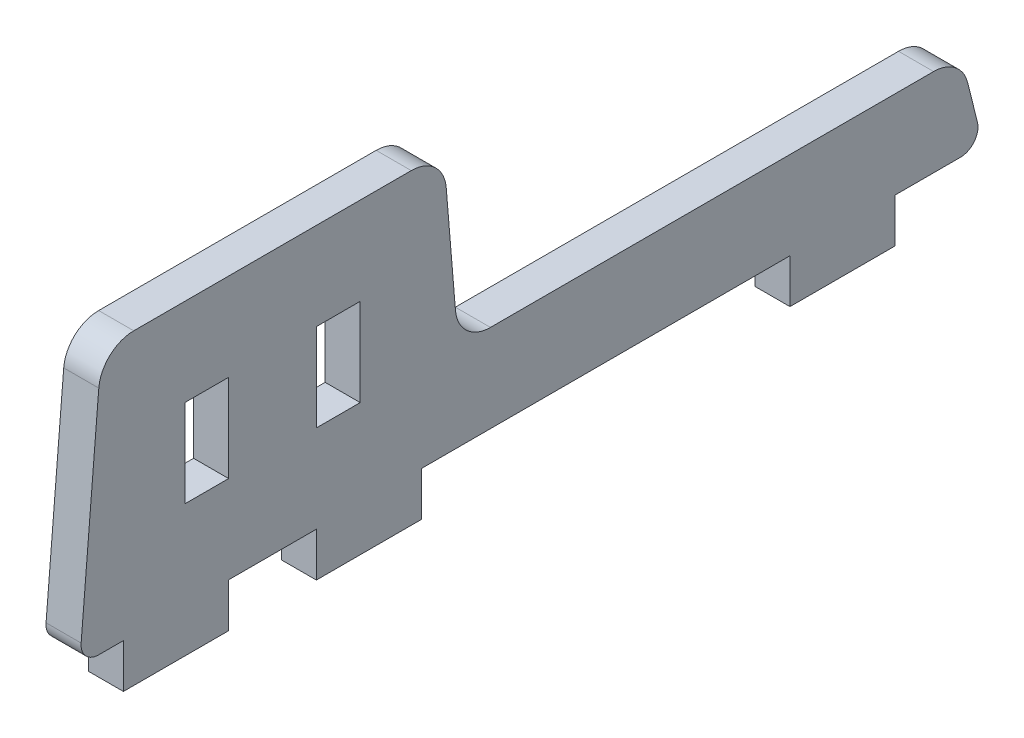
ISO-10303-21;
HEADER;
FILE_DESCRIPTION(('STEP AP214'),'2;1');
FILE_NAME('part.step','',(''),(''),'','','');
FILE_SCHEMA(('AUTOMOTIVE_DESIGN { 1 0 10303 214 1 1 1 1 }'));
ENDSEC;
DATA;
#1=APPLICATION_CONTEXT('core data for automotive mechanical design processes');
#2=APPLICATION_PROTOCOL_DEFINITION('international standard','automotive_design',2000,#1);
#3=PRODUCT_CONTEXT('',#1,'mechanical');
#4=PRODUCT('Part','Part','',(#3));
#5=PRODUCT_RELATED_PRODUCT_CATEGORY('part','',(#4));
#6=PRODUCT_DEFINITION_FORMATION('','',#4);
#7=PRODUCT_DEFINITION_CONTEXT('part definition',#1,'design');
#8=PRODUCT_DEFINITION('design','',#6,#7);
#9=PRODUCT_DEFINITION_SHAPE('','',#8);
#10=(LENGTH_UNIT() NAMED_UNIT(*) SI_UNIT(.MILLI.,.METRE.));
#11=(NAMED_UNIT(*) PLANE_ANGLE_UNIT() SI_UNIT($,.RADIAN.));
#12=(NAMED_UNIT(*) SI_UNIT($,.STERADIAN.) SOLID_ANGLE_UNIT());
#13=UNCERTAINTY_MEASURE_WITH_UNIT(LENGTH_MEASURE(1.E-05),#10,'distance_accuracy_value','');
#14=(GEOMETRIC_REPRESENTATION_CONTEXT(3) GLOBAL_UNCERTAINTY_ASSIGNED_CONTEXT((#13)) GLOBAL_UNIT_ASSIGNED_CONTEXT((#10,
#11,#12)) REPRESENTATION_CONTEXT('',''));
#15=CARTESIAN_POINT('',(0.,0.,0.));
#16=DIRECTION('',(0.,0.,1.));
#17=DIRECTION('',(1.,0.,0.));
#18=AXIS2_PLACEMENT_3D('',#15,#16,#17);
#19=CARTESIAN_POINT('',(4.,0.,0.));
#20=DIRECTION('',(-1.,0.,0.));
#21=DIRECTION('',(0.,0.,1.));
#22=AXIS2_PLACEMENT_3D('',#19,#20,#21);
#23=PLANE('',#22);
#24=DIRECTION('',(0.,1.,0.));
#25=VECTOR('',#24,1.);
#26=CARTESIAN_POINT('',(4.,5.,34.5));
#27=LINE('',#26,#25);
#28=CARTESIAN_POINT('',(4.,-5.,34.5));
#29=VERTEX_POINT('',#28);
#30=CARTESIAN_POINT('',(4.,5.,34.5));
#31=VERTEX_POINT('',#30);
#32=EDGE_CURVE('E293',#29,#31,#27,.T.);
#33=ORIENTED_EDGE('',*,*,#32,.F.);
#34=DIRECTION('',(0.,0.,-1.));
#35=VECTOR('',#34,1.);
#36=CARTESIAN_POINT('',(4.,-5.,39.5));
#37=LINE('',#36,#35);
#38=CARTESIAN_POINT('',(4.,-5.,39.5));
#39=VERTEX_POINT('',#38);
#40=EDGE_CURVE('E301',#39,#29,#37,.T.);
#41=ORIENTED_EDGE('',*,*,#40,.F.);
#42=DIRECTION('',(0.,-1.,0.));
#43=VECTOR('',#42,1.);
#44=CARTESIAN_POINT('',(4.,5.,39.5));
#45=LINE('',#44,#43);
#46=CARTESIAN_POINT('',(4.,5.,39.5));
#47=VERTEX_POINT('',#46);
#48=EDGE_CURVE('E298',#47,#39,#45,.T.);
#49=ORIENTED_EDGE('',*,*,#48,.F.);
#50=DIRECTION('',(0.,0.,1.));
#51=VECTOR('',#50,1.);
#52=CARTESIAN_POINT('',(4.,5.,39.5));
#53=LINE('',#52,#51);
#54=EDGE_CURVE('E295',#31,#47,#53,.T.);
#55=ORIENTED_EDGE('',*,*,#54,.F.);
#56=EDGE_LOOP('',(#33,#41,#49,#55));
#57=FACE_BOUND('',#56,.T.);
#58=DIRECTION('',(0.,0.,-1.));
#59=VECTOR('',#58,1.);
#60=CARTESIAN_POINT('',(4.,-15.,-41.5));
#61=LINE('',#60,#59);
#62=CARTESIAN_POINT('',(4.,-15.,-41.5));
#63=VERTEX_POINT('',#62);
#64=CARTESIAN_POINT('',(4.,-15.,-48.9384471871912));
#65=VERTEX_POINT('',#64);
#66=EDGE_CURVE('E324',#63,#65,#61,.T.);
#67=ORIENTED_EDGE('',*,*,#66,.T.);
#68=CARTESIAN_POINT('',(4.,-13.,-48.9384471871912));
#69=DIRECTION('',(-1.,0.,0.));
#70=DIRECTION('',(0.,0.,1.));
#71=AXIS2_PLACEMENT_3D('',#68,#69,#70);
#72=CIRCLE('',#71,2.);
#73=CARTESIAN_POINT('',(4.,-12.5149287499273,-50.8787321874818));
#74=VERTEX_POINT('',#73);
#75=EDGE_CURVE('E487',#65,#74,#72,.F.);
#76=ORIENTED_EDGE('',*,*,#75,.T.);
#77=DIRECTION('',(0.,0.970142500145332,0.242535625036334));
#78=VECTOR('',#77,1.);
#79=CARTESIAN_POINT('',(4.,-15.,-51.5));
#80=LINE('',#79,#78);
#81=CARTESIAN_POINT('',(4.,-8.02985749985466,-49.7574643749637));
#82=VERTEX_POINT('',#81);
#83=EDGE_CURVE('E327',#74,#82,#80,.T.);
#84=ORIENTED_EDGE('',*,*,#83,.T.);
#85=CARTESIAN_POINT('',(4.,-9.,-45.8768943743824));
#86=DIRECTION('',(-1.,0.,0.));
#87=DIRECTION('',(0.,0.,1.));
#88=AXIS2_PLACEMENT_3D('',#85,#86,#87);
#89=CIRCLE('',#88,4.);
#90=CARTESIAN_POINT('',(4.,-5.,-45.8768943743823));
#91=VERTEX_POINT('',#90);
#92=EDGE_CURVE('E463',#82,#91,#89,.F.);
#93=ORIENTED_EDGE('',*,*,#92,.T.);
#94=DIRECTION('',(0.,0.,1.));
#95=VECTOR('',#94,1.);
#96=CARTESIAN_POINT('',(4.,-5.,8.33333333333332));
#97=LINE('',#96,#95);
#98=CARTESIAN_POINT('',(4.,-5.,4.65280180706921));
#99=VERTEX_POINT('',#98);
#100=EDGE_CURVE('E330',#91,#99,#97,.T.);
#101=ORIENTED_EDGE('',*,*,#100,.T.);
#102=CARTESIAN_POINT('',(4.,-0.999999999999997,4.65280180706921));
#103=DIRECTION('',(-1.,0.,0.));
#104=DIRECTION('',(0.,0.,1.));
#105=AXIS2_PLACEMENT_3D('',#102,#103,#104);
#106=CIRCLE('',#105,4.);
#107=CARTESIAN_POINT('',(4.,-1.33218191941495,8.63898484004873));
#108=VERTEX_POINT('',#107);
#109=EDGE_CURVE('E475',#99,#108,#106,.T.);
#110=ORIENTED_EDGE('',*,*,#109,.T.);
#111=DIRECTION('',(0.,0.99654575824488,0.0830454798537367));
#112=VECTOR('',#111,1.);
#113=CARTESIAN_POINT('',(4.,-5.,8.33333333333332));
#114=LINE('',#113,#112);
#115=CARTESIAN_POINT('',(4.,11.3321819194149,9.69434849328451));
#116=VERTEX_POINT('',#115);
#117=EDGE_CURVE('E333',#108,#116,#114,.T.);
#118=ORIENTED_EDGE('',*,*,#117,.T.);
#119=CARTESIAN_POINT('',(4.,11.,13.680531526264));
#120=DIRECTION('',(-1.,0.,0.));
#121=DIRECTION('',(0.,0.,1.));
#122=AXIS2_PLACEMENT_3D('',#119,#120,#121);
#123=CIRCLE('',#122,4.);
#124=CARTESIAN_POINT('',(4.,15.,13.680531526264));
#125=VERTEX_POINT('',#124);
#126=EDGE_CURVE('E461',#116,#125,#123,.F.);
#127=ORIENTED_EDGE('',*,*,#126,.T.);
#128=DIRECTION('',(0.,0.,1.));
#129=VECTOR('',#128,1.);
#130=CARTESIAN_POINT('',(4.,15.,48.9999999999999));
#131=LINE('',#130,#129);
#132=CARTESIAN_POINT('',(4.,15.,45.3194684737358));
#133=VERTEX_POINT('',#132);
#134=EDGE_CURVE('E336',#125,#133,#131,.T.);
#135=ORIENTED_EDGE('',*,*,#134,.T.);
#136=CARTESIAN_POINT('',(4.,11.,45.3194684737358));
#137=DIRECTION('',(-1.,0.,0.));
#138=DIRECTION('',(0.,0.,1.));
#139=AXIS2_PLACEMENT_3D('',#136,#137,#138);
#140=CIRCLE('',#139,4.);
#141=CARTESIAN_POINT('',(4.,11.332181919415,49.3056515067154));
#142=VERTEX_POINT('',#141);
#143=EDGE_CURVE('E459',#133,#142,#140,.F.);
#144=ORIENTED_EDGE('',*,*,#143,.T.);
#145=DIRECTION('',(0.,-0.99654575824488,0.0830454798537421));
#146=VECTOR('',#145,1.);
#147=CARTESIAN_POINT('',(4.,-15.,51.5));
#148=LINE('',#147,#146);
#149=CARTESIAN_POINT('',(4.,-12.8339090402925,51.3194924200244));
#150=VERTEX_POINT('',#149);
#151=EDGE_CURVE('E339',#142,#150,#148,.T.);
#152=ORIENTED_EDGE('',*,*,#151,.T.);
#153=CARTESIAN_POINT('',(4.,-13.,49.3264009035346));
#154=DIRECTION('',(-1.,0.,0.));
#155=DIRECTION('',(0.,0.,1.));
#156=AXIS2_PLACEMENT_3D('',#153,#154,#155);
#157=CIRCLE('',#156,2.);
#158=CARTESIAN_POINT('',(4.,-15.,49.3264009035346));
#159=VERTEX_POINT('',#158);
#160=EDGE_CURVE('E57',#150,#159,#157,.F.);
#161=ORIENTED_EDGE('',*,*,#160,.T.);
#162=DIRECTION('',(0.,0.,-1.));
#163=VECTOR('',#162,1.);
#164=CARTESIAN_POINT('',(4.,-15.,51.5));
#165=LINE('',#164,#163);
#166=CARTESIAN_POINT('',(4.,-15.,46.5));
#167=VERTEX_POINT('',#166);
#168=EDGE_CURVE('E341',#159,#167,#165,.T.);
#169=ORIENTED_EDGE('',*,*,#168,.T.);
#170=DIRECTION('',(0.,-1.,0.));
#171=VECTOR('',#170,1.);
#172=CARTESIAN_POINT('',(4.,-15.,46.5));
#173=LINE('',#172,#171);
#174=CARTESIAN_POINT('',(4.,-20.0256187336945,46.5));
#175=VERTEX_POINT('',#174);
#176=EDGE_CURVE('E343',#167,#175,#173,.T.);
#177=ORIENTED_EDGE('',*,*,#176,.T.);
#178=DIRECTION('',(0.,0.,-1.));
#179=VECTOR('',#178,1.);
#180=CARTESIAN_POINT('',(4.,-20.0256187336945,46.5));
#181=LINE('',#180,#179);
#182=CARTESIAN_POINT('',(4.,-20.0256187336945,34.5));
#183=VERTEX_POINT('',#182);
#184=EDGE_CURVE('E345',#175,#183,#181,.T.);
#185=ORIENTED_EDGE('',*,*,#184,.T.);
#186=DIRECTION('',(0.,1.,0.));
#187=VECTOR('',#186,1.);
#188=CARTESIAN_POINT('',(4.,-20.0256187336945,34.5));
#189=LINE('',#188,#187);
#190=CARTESIAN_POINT('',(4.,-15.,34.5));
#191=VERTEX_POINT('',#190);
#192=EDGE_CURVE('E347',#183,#191,#189,.T.);
#193=ORIENTED_EDGE('',*,*,#192,.T.);
#194=DIRECTION('',(0.,0.,-1.));
#195=VECTOR('',#194,1.);
#196=CARTESIAN_POINT('',(4.,-15.,34.5));
#197=LINE('',#196,#195);
#198=CARTESIAN_POINT('',(4.,-15.,24.5));
#199=VERTEX_POINT('',#198);
#200=EDGE_CURVE('E349',#191,#199,#197,.T.);
#201=ORIENTED_EDGE('',*,*,#200,.T.);
#202=DIRECTION('',(0.,-1.,0.));
#203=VECTOR('',#202,1.);
#204=CARTESIAN_POINT('',(4.,-15.,24.5));
#205=LINE('',#204,#203);
#206=CARTESIAN_POINT('',(4.,-20.0256187336945,24.5));
#207=VERTEX_POINT('',#206);
#208=EDGE_CURVE('E351',#199,#207,#205,.T.);
#209=ORIENTED_EDGE('',*,*,#208,.T.);
#210=DIRECTION('',(0.,0.,-1.));
#211=VECTOR('',#210,1.);
#212=CARTESIAN_POINT('',(4.,-20.0256187336945,24.5));
#213=LINE('',#212,#211);
#214=CARTESIAN_POINT('',(4.,-20.0256187336945,12.5));
#215=VERTEX_POINT('',#214);
#216=EDGE_CURVE('E353',#207,#215,#213,.T.);
#217=ORIENTED_EDGE('',*,*,#216,.T.);
#218=DIRECTION('',(0.,1.,0.));
#219=VECTOR('',#218,1.);
#220=CARTESIAN_POINT('',(4.,-20.0256187336945,12.5));
#221=LINE('',#220,#219);
#222=CARTESIAN_POINT('',(4.,-15.,12.5));
#223=VERTEX_POINT('',#222);
#224=EDGE_CURVE('E355',#215,#223,#221,.T.);
#225=ORIENTED_EDGE('',*,*,#224,.T.);
#226=DIRECTION('',(0.,0.,-1.));
#227=VECTOR('',#226,1.);
#228=CARTESIAN_POINT('',(4.,-15.,12.5));
#229=LINE('',#228,#227);
#230=CARTESIAN_POINT('',(4.,-15.,-29.5));
#231=VERTEX_POINT('',#230);
#232=EDGE_CURVE('E357',#223,#231,#229,.T.);
#233=ORIENTED_EDGE('',*,*,#232,.T.);
#234=DIRECTION('',(0.,-1.,0.));
#235=VECTOR('',#234,1.);
#236=CARTESIAN_POINT('',(4.,-15.,-29.5));
#237=LINE('',#236,#235);
#238=CARTESIAN_POINT('',(4.,-20.0256187336945,-29.5));
#239=VERTEX_POINT('',#238);
#240=EDGE_CURVE('E359',#231,#239,#237,.T.);
#241=ORIENTED_EDGE('',*,*,#240,.T.);
#242=DIRECTION('',(0.,0.,-1.));
#243=VECTOR('',#242,1.);
#244=CARTESIAN_POINT('',(4.,-20.0256187336945,-29.5));
#245=LINE('',#244,#243);
#246=CARTESIAN_POINT('',(4.,-20.0256187336945,-41.5));
#247=VERTEX_POINT('',#246);
#248=EDGE_CURVE('E361',#239,#247,#245,.T.);
#249=ORIENTED_EDGE('',*,*,#248,.T.);
#250=DIRECTION('',(0.,1.,0.));
#251=VECTOR('',#250,1.);
#252=CARTESIAN_POINT('',(4.,-20.0256187336945,-41.5));
#253=LINE('',#252,#251);
#254=EDGE_CURVE('E363',#247,#63,#253,.T.);
#255=ORIENTED_EDGE('',*,*,#254,.T.);
#256=EDGE_LOOP('',(#67,#76,#84,#93,#101,#110,#118,#127,#135,#144,#152,#161,#169,#177,#185,#193,
#201,#209,#217,#225,#233,#241,#249,#255));
#257=FACE_BOUND('',#256,.T.);
#258=DIRECTION('',(0.,1.,0.));
#259=VECTOR('',#258,1.);
#260=CARTESIAN_POINT('',(4.,5.,19.5));
#261=LINE('',#260,#259);
#262=CARTESIAN_POINT('',(4.,-5.,19.5));
#263=VERTEX_POINT('',#262);
#264=CARTESIAN_POINT('',(4.,5.,19.5));
#265=VERTEX_POINT('',#264);
#266=EDGE_CURVE('E252',#263,#265,#261,.T.);
#267=ORIENTED_EDGE('',*,*,#266,.F.);
#268=DIRECTION('',(0.,0.,-1.));
#269=VECTOR('',#268,1.);
#270=CARTESIAN_POINT('',(4.,-5.,24.5));
#271=LINE('',#270,#269);
#272=CARTESIAN_POINT('',(4.,-5.,24.5));
#273=VERTEX_POINT('',#272);
#274=EDGE_CURVE('E277',#273,#263,#271,.T.);
#275=ORIENTED_EDGE('',*,*,#274,.F.);
#276=DIRECTION('',(0.,-1.,0.));
#277=VECTOR('',#276,1.);
#278=CARTESIAN_POINT('',(4.,5.,24.5));
#279=LINE('',#278,#277);
#280=CARTESIAN_POINT('',(4.,5.,24.5));
#281=VERTEX_POINT('',#280);
#282=EDGE_CURVE('E275',#281,#273,#279,.T.);
#283=ORIENTED_EDGE('',*,*,#282,.F.);
#284=DIRECTION('',(0.,0.,1.));
#285=VECTOR('',#284,1.);
#286=CARTESIAN_POINT('',(4.,5.,24.5));
#287=LINE('',#286,#285);
#288=EDGE_CURVE('E262',#265,#281,#287,.T.);
#289=ORIENTED_EDGE('',*,*,#288,.F.);
#290=EDGE_LOOP('',(#267,#275,#283,#289));
#291=FACE_BOUND('',#290,.T.);
#292=ADVANCED_FACE('F42',(#57,#257,#291),#23,.F.);
#293=CARTESIAN_POINT('',(0.,0.,0.));
#294=DIRECTION('',(-1.,0.,0.));
#295=DIRECTION('',(0.,0.,1.));
#296=AXIS2_PLACEMENT_3D('',#293,#294,#295);
#297=PLANE('',#296);
#298=DIRECTION('',(0.,0.970142500145332,0.242535625036334));
#299=VECTOR('',#298,1.);
#300=CARTESIAN_POINT('',(0.,-15.,-51.5));
#301=LINE('',#300,#299);
#302=CARTESIAN_POINT('',(0.,-12.5149287499273,-50.8787321874818));
#303=VERTEX_POINT('',#302);
#304=CARTESIAN_POINT('',(0.,-8.02985749985466,-49.7574643749637));
#305=VERTEX_POINT('',#304);
#306=EDGE_CURVE('E368',#303,#305,#301,.T.);
#307=ORIENTED_EDGE('',*,*,#306,.F.);
#308=CARTESIAN_POINT('',(0.,-13.,-48.9384471871912));
#309=DIRECTION('',(-1.,0.,0.));
#310=DIRECTION('',(0.,0.,1.));
#311=AXIS2_PLACEMENT_3D('',#308,#309,#310);
#312=CIRCLE('',#311,2.);
#313=CARTESIAN_POINT('',(0.,-15.,-48.9384471871912));
#314=VERTEX_POINT('',#313);
#315=EDGE_CURVE('E482',#303,#314,#312,.T.);
#316=ORIENTED_EDGE('',*,*,#315,.T.);
#317=DIRECTION('',(0.,0.,-1.));
#318=VECTOR('',#317,1.);
#319=CARTESIAN_POINT('',(0.,-15.,-41.5));
#320=LINE('',#319,#318);
#321=CARTESIAN_POINT('',(0.,-15.,-41.5));
#322=VERTEX_POINT('',#321);
#323=EDGE_CURVE('E323',#322,#314,#320,.T.);
#324=ORIENTED_EDGE('',*,*,#323,.F.);
#325=DIRECTION('',(0.,1.,0.));
#326=VECTOR('',#325,1.);
#327=CARTESIAN_POINT('',(0.,-20.0256187336945,-41.5));
#328=LINE('',#327,#326);
#329=CARTESIAN_POINT('',(0.,-20.0256187336945,-41.5));
#330=VERTEX_POINT('',#329);
#331=EDGE_CURVE('E328',#330,#322,#328,.T.);
#332=ORIENTED_EDGE('',*,*,#331,.F.);
#333=DIRECTION('',(0.,0.,-1.));
#334=VECTOR('',#333,1.);
#335=CARTESIAN_POINT('',(0.,-20.0256187336945,-29.5));
#336=LINE('',#335,#334);
#337=CARTESIAN_POINT('',(0.,-20.0256187336945,-29.5));
#338=VERTEX_POINT('',#337);
#339=EDGE_CURVE('E401',#338,#330,#336,.T.);
#340=ORIENTED_EDGE('',*,*,#339,.F.);
#341=DIRECTION('',(0.,-1.,0.));
#342=VECTOR('',#341,1.);
#343=CARTESIAN_POINT('',(0.,-15.,-29.5));
#344=LINE('',#343,#342);
#345=CARTESIAN_POINT('',(0.,-15.,-29.5));
#346=VERTEX_POINT('',#345);
#347=EDGE_CURVE('E399',#346,#338,#344,.T.);
#348=ORIENTED_EDGE('',*,*,#347,.F.);
#349=DIRECTION('',(0.,0.,-1.));
#350=VECTOR('',#349,1.);
#351=CARTESIAN_POINT('',(0.,-15.,12.5));
#352=LINE('',#351,#350);
#353=CARTESIAN_POINT('',(0.,-15.,12.5));
#354=VERTEX_POINT('',#353);
#355=EDGE_CURVE('E397',#354,#346,#352,.T.);
#356=ORIENTED_EDGE('',*,*,#355,.F.);
#357=DIRECTION('',(0.,1.,0.));
#358=VECTOR('',#357,1.);
#359=CARTESIAN_POINT('',(0.,-20.0256187336945,12.5));
#360=LINE('',#359,#358);
#361=CARTESIAN_POINT('',(0.,-20.0256187336945,12.5));
#362=VERTEX_POINT('',#361);
#363=EDGE_CURVE('E395',#362,#354,#360,.T.);
#364=ORIENTED_EDGE('',*,*,#363,.F.);
#365=DIRECTION('',(0.,0.,-1.));
#366=VECTOR('',#365,1.);
#367=CARTESIAN_POINT('',(0.,-20.0256187336945,24.5));
#368=LINE('',#367,#366);
#369=CARTESIAN_POINT('',(0.,-20.0256187336945,24.5));
#370=VERTEX_POINT('',#369);
#371=EDGE_CURVE('E393',#370,#362,#368,.T.);
#372=ORIENTED_EDGE('',*,*,#371,.F.);
#373=DIRECTION('',(0.,-1.,0.));
#374=VECTOR('',#373,1.);
#375=CARTESIAN_POINT('',(0.,-15.,24.5));
#376=LINE('',#375,#374);
#377=CARTESIAN_POINT('',(0.,-15.,24.5));
#378=VERTEX_POINT('',#377);
#379=EDGE_CURVE('E391',#378,#370,#376,.T.);
#380=ORIENTED_EDGE('',*,*,#379,.F.);
#381=DIRECTION('',(0.,0.,-1.));
#382=VECTOR('',#381,1.);
#383=CARTESIAN_POINT('',(0.,-15.,34.5));
#384=LINE('',#383,#382);
#385=CARTESIAN_POINT('',(0.,-15.,34.5));
#386=VERTEX_POINT('',#385);
#387=EDGE_CURVE('E389',#386,#378,#384,.T.);
#388=ORIENTED_EDGE('',*,*,#387,.F.);
#389=DIRECTION('',(0.,1.,0.));
#390=VECTOR('',#389,1.);
#391=CARTESIAN_POINT('',(0.,-20.0256187336945,34.5));
#392=LINE('',#391,#390);
#393=CARTESIAN_POINT('',(0.,-20.0256187336945,34.5));
#394=VERTEX_POINT('',#393);
#395=EDGE_CURVE('E387',#394,#386,#392,.T.);
#396=ORIENTED_EDGE('',*,*,#395,.F.);
#397=DIRECTION('',(0.,0.,-1.));
#398=VECTOR('',#397,1.);
#399=CARTESIAN_POINT('',(0.,-20.0256187336945,46.5));
#400=LINE('',#399,#398);
#401=CARTESIAN_POINT('',(0.,-20.0256187336945,46.5));
#402=VERTEX_POINT('',#401);
#403=EDGE_CURVE('E385',#402,#394,#400,.T.);
#404=ORIENTED_EDGE('',*,*,#403,.F.);
#405=DIRECTION('',(0.,-1.,0.));
#406=VECTOR('',#405,1.);
#407=CARTESIAN_POINT('',(0.,-15.,46.5));
#408=LINE('',#407,#406);
#409=CARTESIAN_POINT('',(0.,-15.,46.5));
#410=VERTEX_POINT('',#409);
#411=EDGE_CURVE('E383',#410,#402,#408,.T.);
#412=ORIENTED_EDGE('',*,*,#411,.F.);
#413=DIRECTION('',(0.,0.,-1.));
#414=VECTOR('',#413,1.);
#415=CARTESIAN_POINT('',(0.,-15.,51.5));
#416=LINE('',#415,#414);
#417=CARTESIAN_POINT('',(0.,-15.,49.3264009035346));
#418=VERTEX_POINT('',#417);
#419=EDGE_CURVE('E381',#418,#410,#416,.T.);
#420=ORIENTED_EDGE('',*,*,#419,.F.);
#421=CARTESIAN_POINT('',(0.,-13.,49.3264009035346));
#422=DIRECTION('',(-1.,0.,0.));
#423=DIRECTION('',(0.,0.,1.));
#424=AXIS2_PLACEMENT_3D('',#421,#422,#423);
#425=CIRCLE('',#424,2.);
#426=CARTESIAN_POINT('',(0.,-12.8339090402925,51.3194924200244));
#427=VERTEX_POINT('',#426);
#428=EDGE_CURVE('E480',#418,#427,#425,.T.);
#429=ORIENTED_EDGE('',*,*,#428,.T.);
#430=DIRECTION('',(0.,-0.99654575824488,0.0830454798537421));
#431=VECTOR('',#430,1.);
#432=CARTESIAN_POINT('',(0.,-15.,51.5));
#433=LINE('',#432,#431);
#434=CARTESIAN_POINT('',(0.,11.332181919415,49.3056515067154));
#435=VERTEX_POINT('',#434);
#436=EDGE_CURVE('E379',#435,#427,#433,.T.);
#437=ORIENTED_EDGE('',*,*,#436,.F.);
#438=CARTESIAN_POINT('',(0.,11.,45.3194684737358));
#439=DIRECTION('',(-1.,0.,0.));
#440=DIRECTION('',(0.,0.,1.));
#441=AXIS2_PLACEMENT_3D('',#438,#439,#440);
#442=CIRCLE('',#441,4.);
#443=CARTESIAN_POINT('',(0.,15.,45.3194684737358));
#444=VERTEX_POINT('',#443);
#445=EDGE_CURVE('E449',#435,#444,#442,.T.);
#446=ORIENTED_EDGE('',*,*,#445,.T.);
#447=DIRECTION('',(0.,0.,1.));
#448=VECTOR('',#447,1.);
#449=CARTESIAN_POINT('',(0.,15.,48.9999999999999));
#450=LINE('',#449,#448);
#451=CARTESIAN_POINT('',(0.,15.,13.680531526264));
#452=VERTEX_POINT('',#451);
#453=EDGE_CURVE('E376',#452,#444,#450,.T.);
#454=ORIENTED_EDGE('',*,*,#453,.F.);
#455=CARTESIAN_POINT('',(0.,11.,13.680531526264));
#456=DIRECTION('',(-1.,0.,0.));
#457=DIRECTION('',(0.,0.,1.));
#458=AXIS2_PLACEMENT_3D('',#455,#456,#457);
#459=CIRCLE('',#458,4.);
#460=CARTESIAN_POINT('',(0.,11.3321819194149,9.69434849328451));
#461=VERTEX_POINT('',#460);
#462=EDGE_CURVE('E451',#452,#461,#459,.T.);
#463=ORIENTED_EDGE('',*,*,#462,.T.);
#464=DIRECTION('',(0.,0.99654575824488,0.0830454798537367));
#465=VECTOR('',#464,1.);
#466=CARTESIAN_POINT('',(0.,-5.,8.33333333333332));
#467=LINE('',#466,#465);
#468=CARTESIAN_POINT('',(0.,-1.33218191941495,8.63898484004873));
#469=VERTEX_POINT('',#468);
#470=EDGE_CURVE('E373',#469,#461,#467,.T.);
#471=ORIENTED_EDGE('',*,*,#470,.F.);
#472=CARTESIAN_POINT('',(0.,-0.999999999999997,4.65280180706921));
#473=DIRECTION('',(-1.,0.,0.));
#474=DIRECTION('',(0.,0.,1.));
#475=AXIS2_PLACEMENT_3D('',#472,#473,#474);
#476=CIRCLE('',#475,4.);
#477=CARTESIAN_POINT('',(0.,-5.,4.65280180706921));
#478=VERTEX_POINT('',#477);
#479=EDGE_CURVE('E473',#469,#478,#476,.F.);
#480=ORIENTED_EDGE('',*,*,#479,.T.);
#481=DIRECTION('',(0.,0.,1.));
#482=VECTOR('',#481,1.);
#483=CARTESIAN_POINT('',(0.,-5.,8.33333333333332));
#484=LINE('',#483,#482);
#485=CARTESIAN_POINT('',(0.,-5.,-45.8768943743823));
#486=VERTEX_POINT('',#485);
#487=EDGE_CURVE('E370',#486,#478,#484,.T.);
#488=ORIENTED_EDGE('',*,*,#487,.F.);
#489=CARTESIAN_POINT('',(0.,-9.,-45.8768943743824));
#490=DIRECTION('',(-1.,0.,0.));
#491=DIRECTION('',(0.,0.,1.));
#492=AXIS2_PLACEMENT_3D('',#489,#490,#491);
#493=CIRCLE('',#492,4.);
#494=EDGE_CURVE('E453',#486,#305,#493,.T.);
#495=ORIENTED_EDGE('',*,*,#494,.T.);
#496=EDGE_LOOP('',(#307,#316,#324,#332,#340,#348,#356,#364,#372,#380,#388,#396,#404,#412,#420,
#429,#437,#446,#454,#463,#471,#480,#488,#495));
#497=FACE_BOUND('',#496,.T.);
#498=DIRECTION('',(0.,0.,-1.));
#499=VECTOR('',#498,1.);
#500=CARTESIAN_POINT('',(0.,-5.,39.5));
#501=LINE('',#500,#499);
#502=CARTESIAN_POINT('',(0.,-5.,39.5));
#503=VERTEX_POINT('',#502);
#504=CARTESIAN_POINT('',(0.,-5.,34.5));
#505=VERTEX_POINT('',#504);
#506=EDGE_CURVE('E296',#503,#505,#501,.T.);
#507=ORIENTED_EDGE('',*,*,#506,.T.);
#508=DIRECTION('',(0.,1.,0.));
#509=VECTOR('',#508,1.);
#510=CARTESIAN_POINT('',(0.,5.,34.5));
#511=LINE('',#510,#509);
#512=CARTESIAN_POINT('',(0.,5.,34.5));
#513=VERTEX_POINT('',#512);
#514=EDGE_CURVE('E270',#505,#513,#511,.T.);
#515=ORIENTED_EDGE('',*,*,#514,.T.);
#516=DIRECTION('',(0.,0.,1.));
#517=VECTOR('',#516,1.);
#518=CARTESIAN_POINT('',(0.,5.,39.5));
#519=LINE('',#518,#517);
#520=CARTESIAN_POINT('',(0.,5.,39.5));
#521=VERTEX_POINT('',#520);
#522=EDGE_CURVE('E306',#513,#521,#519,.T.);
#523=ORIENTED_EDGE('',*,*,#522,.T.);
#524=DIRECTION('',(0.,-1.,0.));
#525=VECTOR('',#524,1.);
#526=CARTESIAN_POINT('',(0.,5.,39.5));
#527=LINE('',#526,#525);
#528=EDGE_CURVE('E309',#521,#503,#527,.T.);
#529=ORIENTED_EDGE('',*,*,#528,.T.);
#530=EDGE_LOOP('',(#507,#515,#523,#529));
#531=FACE_BOUND('',#530,.T.);
#532=DIRECTION('',(0.,0.,-1.));
#533=VECTOR('',#532,1.);
#534=CARTESIAN_POINT('',(0.,-5.,24.5));
#535=LINE('',#534,#533);
#536=CARTESIAN_POINT('',(0.,-5.,24.5));
#537=VERTEX_POINT('',#536);
#538=CARTESIAN_POINT('',(0.,-5.,19.5));
#539=VERTEX_POINT('',#538);
#540=EDGE_CURVE('E263',#537,#539,#535,.T.);
#541=ORIENTED_EDGE('',*,*,#540,.T.);
#542=DIRECTION('',(0.,1.,0.));
#543=VECTOR('',#542,1.);
#544=CARTESIAN_POINT('',(0.,5.,19.5));
#545=LINE('',#544,#543);
#546=CARTESIAN_POINT('',(0.,5.,19.5));
#547=VERTEX_POINT('',#546);
#548=EDGE_CURVE('E281',#539,#547,#545,.T.);
#549=ORIENTED_EDGE('',*,*,#548,.T.);
#550=DIRECTION('',(0.,0.,1.));
#551=VECTOR('',#550,1.);
#552=CARTESIAN_POINT('',(0.,5.,24.5));
#553=LINE('',#552,#551);
#554=CARTESIAN_POINT('',(0.,5.,24.5));
#555=VERTEX_POINT('',#554);
#556=EDGE_CURVE('E269',#547,#555,#553,.T.);
#557=ORIENTED_EDGE('',*,*,#556,.T.);
#558=DIRECTION('',(0.,-1.,0.));
#559=VECTOR('',#558,1.);
#560=CARTESIAN_POINT('',(0.,5.,24.5));
#561=LINE('',#560,#559);
#562=EDGE_CURVE('E284',#555,#537,#561,.T.);
#563=ORIENTED_EDGE('',*,*,#562,.T.);
#564=EDGE_LOOP('',(#541,#549,#557,#563));
#565=FACE_BOUND('',#564,.T.);
#566=ADVANCED_FACE('F498',(#497,#531,#565),#297,.T.);
#567=CARTESIAN_POINT('',(4.,-15.,-41.5));
#568=DIRECTION('',(0.,1.,0.));
#569=DIRECTION('',(0.,0.,1.));
#570=AXIS2_PLACEMENT_3D('',#567,#568,#569);
#571=PLANE('',#570);
#572=ORIENTED_EDGE('',*,*,#323,.T.);
#573=DIRECTION('',(-1.,0.,0.));
#574=VECTOR('',#573,1.);
#575=CARTESIAN_POINT('',(4.,-15.,-48.9384471871912));
#576=LINE('',#575,#574);
#577=EDGE_CURVE('E484',#314,#65,#576,.F.);
#578=ORIENTED_EDGE('',*,*,#577,.T.);
#579=ORIENTED_EDGE('',*,*,#66,.F.);
#580=DIRECTION('',(-1.,0.,0.));
#581=VECTOR('',#580,1.);
#582=CARTESIAN_POINT('',(4.,-15.,-41.5));
#583=LINE('',#582,#581);
#584=EDGE_CURVE('E365',#63,#322,#583,.T.);
#585=ORIENTED_EDGE('',*,*,#584,.T.);
#586=EDGE_LOOP('',(#572,#578,#579,#585));
#587=FACE_BOUND('',#586,.T.);
#588=ADVANCED_FACE('F609',(#587),#571,.F.);
#589=CARTESIAN_POINT('',(4.,-15.,-51.5));
#590=DIRECTION('',(0.,-0.242535625036334,0.970142500145332));
#591=DIRECTION('',(0.,-0.970142500145332,-0.242535625036334));
#592=AXIS2_PLACEMENT_3D('',#589,#590,#591);
#593=PLANE('',#592);
#594=ORIENTED_EDGE('',*,*,#83,.F.);
#595=DIRECTION('',(-1.,0.,0.));
#596=VECTOR('',#595,1.);
#597=CARTESIAN_POINT('',(4.,-12.5149287499273,-50.8787321874818));
#598=LINE('',#597,#596);
#599=EDGE_CURVE('E477',#74,#303,#598,.T.);
#600=ORIENTED_EDGE('',*,*,#599,.T.);
#601=ORIENTED_EDGE('',*,*,#306,.T.);
#602=DIRECTION('',(-1.,0.,0.));
#603=VECTOR('',#602,1.);
#604=CARTESIAN_POINT('',(4.,-8.02985749985466,-49.7574643749637));
#605=LINE('',#604,#603);
#606=EDGE_CURVE('E456',#305,#82,#605,.F.);
#607=ORIENTED_EDGE('',*,*,#606,.T.);
#608=EDGE_LOOP('',(#594,#600,#601,#607));
#609=FACE_BOUND('',#608,.T.);
#610=ADVANCED_FACE('F564',(#609),#593,.F.);
#611=CARTESIAN_POINT('',(4.,-5.,8.33333333333332));
#612=DIRECTION('',(0.,-1.,0.));
#613=DIRECTION('',(0.,0.,-1.));
#614=AXIS2_PLACEMENT_3D('',#611,#612,#613);
#615=PLANE('',#614);
#616=ORIENTED_EDGE('',*,*,#487,.T.);
#617=DIRECTION('',(-1.,0.,0.));
#618=VECTOR('',#617,1.);
#619=CARTESIAN_POINT('',(4.,-5.,4.65280180706921));
#620=LINE('',#619,#618);
#621=EDGE_CURVE('E447',#478,#99,#620,.F.);
#622=ORIENTED_EDGE('',*,*,#621,.T.);
#623=ORIENTED_EDGE('',*,*,#100,.F.);
#624=DIRECTION('',(-1.,0.,0.));
#625=VECTOR('',#624,1.);
#626=CARTESIAN_POINT('',(4.,-5.,-45.8768943743824));
#627=LINE('',#626,#625);
#628=EDGE_CURVE('E444',#91,#486,#627,.T.);
#629=ORIENTED_EDGE('',*,*,#628,.T.);
#630=EDGE_LOOP('',(#616,#622,#623,#629));
#631=FACE_BOUND('',#630,.T.);
#632=ADVANCED_FACE('F575',(#631),#615,.F.);
#633=CARTESIAN_POINT('',(4.,-5.,8.33333333333332));
#634=DIRECTION('',(0.,-0.0830454798537367,0.99654575824488));
#635=DIRECTION('',(0.,-0.99654575824488,-0.0830454798537367));
#636=AXIS2_PLACEMENT_3D('',#633,#634,#635);
#637=PLANE('',#636);
#638=ORIENTED_EDGE('',*,*,#117,.F.);
#639=DIRECTION('',(-1.,0.,0.));
#640=VECTOR('',#639,1.);
#641=CARTESIAN_POINT('',(0.,-1.33218191941494,8.63898484004873));
#642=LINE('',#641,#640);
#643=EDGE_CURVE('E441',#108,#469,#642,.T.);
#644=ORIENTED_EDGE('',*,*,#643,.T.);
#645=ORIENTED_EDGE('',*,*,#470,.T.);
#646=DIRECTION('',(-1.,0.,0.));
#647=VECTOR('',#646,1.);
#648=CARTESIAN_POINT('',(4.,11.3321819194149,9.69434849328451));
#649=LINE('',#648,#647);
#650=EDGE_CURVE('E439',#461,#116,#649,.F.);
#651=ORIENTED_EDGE('',*,*,#650,.T.);
#652=EDGE_LOOP('',(#638,#644,#645,#651));
#653=FACE_BOUND('',#652,.T.);
#654=ADVANCED_FACE('F583',(#653),#637,.F.);
#655=CARTESIAN_POINT('',(4.,15.,48.9999999999999));
#656=DIRECTION('',(0.,-1.,0.));
#657=DIRECTION('',(0.,0.,-1.));
#658=AXIS2_PLACEMENT_3D('',#655,#656,#657);
#659=PLANE('',#658);
#660=ORIENTED_EDGE('',*,*,#134,.F.);
#661=DIRECTION('',(-1.,0.,0.));
#662=VECTOR('',#661,1.);
#663=CARTESIAN_POINT('',(4.,15.,13.680531526264));
#664=LINE('',#663,#662);
#665=EDGE_CURVE('E467',#125,#452,#664,.T.);
#666=ORIENTED_EDGE('',*,*,#665,.T.);
#667=ORIENTED_EDGE('',*,*,#453,.T.);
#668=DIRECTION('',(-1.,0.,0.));
#669=VECTOR('',#668,1.);
#670=CARTESIAN_POINT('',(4.,15.,45.3194684737358));
#671=LINE('',#670,#669);
#672=EDGE_CURVE('E465',#444,#133,#671,.F.);
#673=ORIENTED_EDGE('',*,*,#672,.T.);
#674=EDGE_LOOP('',(#660,#666,#667,#673));
#675=FACE_BOUND('',#674,.T.);
#676=ADVANCED_FACE('F592',(#675),#659,.F.);
#677=CARTESIAN_POINT('',(4.,-15.,51.5));
#678=DIRECTION('',(0.,-0.0830454798537421,-0.99654575824488));
#679=DIRECTION('',(0.,0.99654575824488,-0.0830454798537421));
#680=AXIS2_PLACEMENT_3D('',#677,#678,#679);
#681=PLANE('',#680);
#682=ORIENTED_EDGE('',*,*,#436,.T.);
#683=DIRECTION('',(-1.,0.,0.));
#684=VECTOR('',#683,1.);
#685=CARTESIAN_POINT('',(4.,-12.8339090402925,51.3194924200244));
#686=LINE('',#685,#684);
#687=EDGE_CURVE('E11',#427,#150,#686,.F.);
#688=ORIENTED_EDGE('',*,*,#687,.T.);
#689=ORIENTED_EDGE('',*,*,#151,.F.);
#690=DIRECTION('',(-1.,0.,0.));
#691=VECTOR('',#690,1.);
#692=CARTESIAN_POINT('',(4.,11.332181919415,49.3056515067154));
#693=LINE('',#692,#691);
#694=EDGE_CURVE('E470',#142,#435,#693,.T.);
#695=ORIENTED_EDGE('',*,*,#694,.T.);
#696=EDGE_LOOP('',(#682,#688,#689,#695));
#697=FACE_BOUND('',#696,.T.);
#698=ADVANCED_FACE('F598',(#697),#681,.F.);
#699=CARTESIAN_POINT('',(4.,-15.,51.5));
#700=DIRECTION('',(0.,1.,0.));
#701=DIRECTION('',(0.,0.,1.));
#702=AXIS2_PLACEMENT_3D('',#699,#700,#701);
#703=PLANE('',#702);
#704=ORIENTED_EDGE('',*,*,#168,.F.);
#705=DIRECTION('',(-1.,0.,0.));
#706=VECTOR('',#705,1.);
#707=CARTESIAN_POINT('',(4.,-15.,49.3264009035346));
#708=LINE('',#707,#706);
#709=EDGE_CURVE('E50',#159,#418,#708,.T.);
#710=ORIENTED_EDGE('',*,*,#709,.T.);
#711=ORIENTED_EDGE('',*,*,#419,.T.);
#712=DIRECTION('',(-1.,0.,0.));
#713=VECTOR('',#712,1.);
#714=CARTESIAN_POINT('',(4.,-15.,46.5));
#715=LINE('',#714,#713);
#716=EDGE_CURVE('E436',#167,#410,#715,.T.);
#717=ORIENTED_EDGE('',*,*,#716,.F.);
#718=EDGE_LOOP('',(#704,#710,#711,#717));
#719=FACE_BOUND('',#718,.T.);
#720=ADVANCED_FACE('F492',(#719),#703,.F.);
#721=CARTESIAN_POINT('',(4.,-15.,46.5));
#722=DIRECTION('',(0.,0.,-1.));
#723=DIRECTION('',(0.,1.,0.));
#724=AXIS2_PLACEMENT_3D('',#721,#722,#723);
#725=PLANE('',#724);
#726=ORIENTED_EDGE('',*,*,#411,.T.);
#727=DIRECTION('',(-1.,0.,0.));
#728=VECTOR('',#727,1.);
#729=CARTESIAN_POINT('',(4.,-20.0256187336945,46.5));
#730=LINE('',#729,#728);
#731=EDGE_CURVE('E433',#175,#402,#730,.T.);
#732=ORIENTED_EDGE('',*,*,#731,.F.);
#733=ORIENTED_EDGE('',*,*,#176,.F.);
#734=ORIENTED_EDGE('',*,*,#716,.T.);
#735=EDGE_LOOP('',(#726,#732,#733,#734));
#736=FACE_BOUND('',#735,.T.);
#737=ADVANCED_FACE('F505',(#736),#725,.F.);
#738=CARTESIAN_POINT('',(4.,-20.0256187336945,46.5));
#739=DIRECTION('',(0.,1.,0.));
#740=DIRECTION('',(0.,0.,1.));
#741=AXIS2_PLACEMENT_3D('',#738,#739,#740);
#742=PLANE('',#741);
#743=ORIENTED_EDGE('',*,*,#403,.T.);
#744=DIRECTION('',(-1.,0.,0.));
#745=VECTOR('',#744,1.);
#746=CARTESIAN_POINT('',(4.,-20.0256187336945,34.5));
#747=LINE('',#746,#745);
#748=EDGE_CURVE('E430',#183,#394,#747,.T.);
#749=ORIENTED_EDGE('',*,*,#748,.F.);
#750=ORIENTED_EDGE('',*,*,#184,.F.);
#751=ORIENTED_EDGE('',*,*,#731,.T.);
#752=EDGE_LOOP('',(#743,#749,#750,#751));
#753=FACE_BOUND('',#752,.T.);
#754=ADVANCED_FACE('F509',(#753),#742,.F.);
#755=CARTESIAN_POINT('',(4.,-20.0256187336945,34.5));
#756=DIRECTION('',(0.,0.,1.));
#757=DIRECTION('',(0.,-1.,0.));
#758=AXIS2_PLACEMENT_3D('',#755,#756,#757);
#759=PLANE('',#758);
#760=ORIENTED_EDGE('',*,*,#395,.T.);
#761=DIRECTION('',(-1.,0.,0.));
#762=VECTOR('',#761,1.);
#763=CARTESIAN_POINT('',(4.,-15.,34.5));
#764=LINE('',#763,#762);
#765=EDGE_CURVE('E427',#191,#386,#764,.T.);
#766=ORIENTED_EDGE('',*,*,#765,.F.);
#767=ORIENTED_EDGE('',*,*,#192,.F.);
#768=ORIENTED_EDGE('',*,*,#748,.T.);
#769=EDGE_LOOP('',(#760,#766,#767,#768));
#770=FACE_BOUND('',#769,.T.);
#771=ADVANCED_FACE('F516',(#770),#759,.F.);
#772=CARTESIAN_POINT('',(4.,-15.,34.5));
#773=DIRECTION('',(0.,1.,0.));
#774=DIRECTION('',(0.,0.,1.));
#775=AXIS2_PLACEMENT_3D('',#772,#773,#774);
#776=PLANE('',#775);
#777=ORIENTED_EDGE('',*,*,#387,.T.);
#778=DIRECTION('',(-1.,0.,0.));
#779=VECTOR('',#778,1.);
#780=CARTESIAN_POINT('',(4.,-15.,24.5));
#781=LINE('',#780,#779);
#782=EDGE_CURVE('E424',#199,#378,#781,.T.);
#783=ORIENTED_EDGE('',*,*,#782,.F.);
#784=ORIENTED_EDGE('',*,*,#200,.F.);
#785=ORIENTED_EDGE('',*,*,#765,.T.);
#786=EDGE_LOOP('',(#777,#783,#784,#785));
#787=FACE_BOUND('',#786,.T.);
#788=ADVANCED_FACE('F519',(#787),#776,.F.);
#789=CARTESIAN_POINT('',(4.,-15.,24.5));
#790=DIRECTION('',(0.,0.,-1.));
#791=DIRECTION('',(0.,1.,0.));
#792=AXIS2_PLACEMENT_3D('',#789,#790,#791);
#793=PLANE('',#792);
#794=ORIENTED_EDGE('',*,*,#379,.T.);
#795=DIRECTION('',(-1.,0.,0.));
#796=VECTOR('',#795,1.);
#797=CARTESIAN_POINT('',(4.,-20.0256187336945,24.5));
#798=LINE('',#797,#796);
#799=EDGE_CURVE('E421',#207,#370,#798,.T.);
#800=ORIENTED_EDGE('',*,*,#799,.F.);
#801=ORIENTED_EDGE('',*,*,#208,.F.);
#802=ORIENTED_EDGE('',*,*,#782,.T.);
#803=EDGE_LOOP('',(#794,#800,#801,#802));
#804=FACE_BOUND('',#803,.T.);
#805=ADVANCED_FACE('F524',(#804),#793,.F.);
#806=CARTESIAN_POINT('',(4.,-20.0256187336945,24.5));
#807=DIRECTION('',(0.,1.,0.));
#808=DIRECTION('',(0.,0.,1.));
#809=AXIS2_PLACEMENT_3D('',#806,#807,#808);
#810=PLANE('',#809);
#811=ORIENTED_EDGE('',*,*,#371,.T.);
#812=DIRECTION('',(-1.,0.,0.));
#813=VECTOR('',#812,1.);
#814=CARTESIAN_POINT('',(4.,-20.0256187336945,12.5));
#815=LINE('',#814,#813);
#816=EDGE_CURVE('E418',#215,#362,#815,.T.);
#817=ORIENTED_EDGE('',*,*,#816,.F.);
#818=ORIENTED_EDGE('',*,*,#216,.F.);
#819=ORIENTED_EDGE('',*,*,#799,.T.);
#820=EDGE_LOOP('',(#811,#817,#818,#819));
#821=FACE_BOUND('',#820,.T.);
#822=ADVANCED_FACE('F530',(#821),#810,.F.);
#823=CARTESIAN_POINT('',(4.,-20.0256187336945,12.5));
#824=DIRECTION('',(0.,0.,1.));
#825=DIRECTION('',(0.,-1.,0.));
#826=AXIS2_PLACEMENT_3D('',#823,#824,#825);
#827=PLANE('',#826);
#828=ORIENTED_EDGE('',*,*,#363,.T.);
#829=DIRECTION('',(-1.,0.,0.));
#830=VECTOR('',#829,1.);
#831=CARTESIAN_POINT('',(4.,-15.,12.5));
#832=LINE('',#831,#830);
#833=EDGE_CURVE('E415',#223,#354,#832,.T.);
#834=ORIENTED_EDGE('',*,*,#833,.F.);
#835=ORIENTED_EDGE('',*,*,#224,.F.);
#836=ORIENTED_EDGE('',*,*,#816,.T.);
#837=EDGE_LOOP('',(#828,#834,#835,#836));
#838=FACE_BOUND('',#837,.T.);
#839=ADVANCED_FACE('F534',(#838),#827,.F.);
#840=CARTESIAN_POINT('',(4.,-15.,12.5));
#841=DIRECTION('',(0.,1.,0.));
#842=DIRECTION('',(0.,0.,1.));
#843=AXIS2_PLACEMENT_3D('',#840,#841,#842);
#844=PLANE('',#843);
#845=ORIENTED_EDGE('',*,*,#355,.T.);
#846=DIRECTION('',(-1.,0.,0.));
#847=VECTOR('',#846,1.);
#848=CARTESIAN_POINT('',(4.,-15.,-29.5));
#849=LINE('',#848,#847);
#850=EDGE_CURVE('E412',#231,#346,#849,.T.);
#851=ORIENTED_EDGE('',*,*,#850,.F.);
#852=ORIENTED_EDGE('',*,*,#232,.F.);
#853=ORIENTED_EDGE('',*,*,#833,.T.);
#854=EDGE_LOOP('',(#845,#851,#852,#853));
#855=FACE_BOUND('',#854,.T.);
#856=ADVANCED_FACE('F539',(#855),#844,.F.);
#857=CARTESIAN_POINT('',(4.,-15.,-29.5));
#858=DIRECTION('',(0.,0.,-1.));
#859=DIRECTION('',(0.,1.,0.));
#860=AXIS2_PLACEMENT_3D('',#857,#858,#859);
#861=PLANE('',#860);
#862=ORIENTED_EDGE('',*,*,#347,.T.);
#863=DIRECTION('',(-1.,0.,0.));
#864=VECTOR('',#863,1.);
#865=CARTESIAN_POINT('',(4.,-20.0256187336945,-29.5));
#866=LINE('',#865,#864);
#867=EDGE_CURVE('E409',#239,#338,#866,.T.);
#868=ORIENTED_EDGE('',*,*,#867,.F.);
#869=ORIENTED_EDGE('',*,*,#240,.F.);
#870=ORIENTED_EDGE('',*,*,#850,.T.);
#871=EDGE_LOOP('',(#862,#868,#869,#870));
#872=FACE_BOUND('',#871,.T.);
#873=ADVANCED_FACE('F545',(#872),#861,.F.);
#874=CARTESIAN_POINT('',(4.,-20.0256187336945,-29.5));
#875=DIRECTION('',(0.,1.,0.));
#876=DIRECTION('',(0.,0.,1.));
#877=AXIS2_PLACEMENT_3D('',#874,#875,#876);
#878=PLANE('',#877);
#879=ORIENTED_EDGE('',*,*,#339,.T.);
#880=DIRECTION('',(-1.,0.,0.));
#881=VECTOR('',#880,1.);
#882=CARTESIAN_POINT('',(4.,-20.0256187336945,-41.5));
#883=LINE('',#882,#881);
#884=EDGE_CURVE('E406',#247,#330,#883,.T.);
#885=ORIENTED_EDGE('',*,*,#884,.F.);
#886=ORIENTED_EDGE('',*,*,#248,.F.);
#887=ORIENTED_EDGE('',*,*,#867,.T.);
#888=EDGE_LOOP('',(#879,#885,#886,#887));
#889=FACE_BOUND('',#888,.T.);
#890=ADVANCED_FACE('F549',(#889),#878,.F.);
#891=CARTESIAN_POINT('',(4.,-20.0256187336945,-41.5));
#892=DIRECTION('',(0.,0.,1.));
#893=DIRECTION('',(1.,0.,0.));
#894=AXIS2_PLACEMENT_3D('',#891,#892,#893);
#895=PLANE('',#894);
#896=ORIENTED_EDGE('',*,*,#331,.T.);
#897=ORIENTED_EDGE('',*,*,#584,.F.);
#898=ORIENTED_EDGE('',*,*,#254,.F.);
#899=ORIENTED_EDGE('',*,*,#884,.T.);
#900=EDGE_LOOP('',(#896,#897,#898,#899));
#901=FACE_BOUND('',#900,.T.);
#902=ADVANCED_FACE('F554',(#901),#895,.F.);
#903=CARTESIAN_POINT('',(4.,5.,34.5));
#904=DIRECTION('',(0.,0.,1.));
#905=DIRECTION('',(1.,0.,0.));
#906=AXIS2_PLACEMENT_3D('',#903,#904,#905);
#907=PLANE('',#906);
#908=ORIENTED_EDGE('',*,*,#514,.F.);
#909=DIRECTION('',(-1.,0.,0.));
#910=VECTOR('',#909,1.);
#911=CARTESIAN_POINT('',(4.,-5.,34.5));
#912=LINE('',#911,#910);
#913=EDGE_CURVE('E303',#29,#505,#912,.T.);
#914=ORIENTED_EDGE('',*,*,#913,.F.);
#915=ORIENTED_EDGE('',*,*,#32,.T.);
#916=DIRECTION('',(-1.,0.,0.));
#917=VECTOR('',#916,1.);
#918=CARTESIAN_POINT('',(4.,5.,34.5));
#919=LINE('',#918,#917);
#920=EDGE_CURVE('E320',#31,#513,#919,.T.);
#921=ORIENTED_EDGE('',*,*,#920,.T.);
#922=EDGE_LOOP('',(#908,#914,#915,#921));
#923=FACE_BOUND('',#922,.T.);
#924=ADVANCED_FACE('F613',(#923),#907,.T.);
#925=CARTESIAN_POINT('',(4.,5.,39.5));
#926=DIRECTION('',(0.,-1.,0.));
#927=DIRECTION('',(0.,0.,-1.));
#928=AXIS2_PLACEMENT_3D('',#925,#926,#927);
#929=PLANE('',#928);
#930=ORIENTED_EDGE('',*,*,#522,.F.);
#931=ORIENTED_EDGE('',*,*,#920,.F.);
#932=ORIENTED_EDGE('',*,*,#54,.T.);
#933=DIRECTION('',(-1.,0.,0.));
#934=VECTOR('',#933,1.);
#935=CARTESIAN_POINT('',(4.,5.,39.5));
#936=LINE('',#935,#934);
#937=EDGE_CURVE('E318',#47,#521,#936,.T.);
#938=ORIENTED_EDGE('',*,*,#937,.T.);
#939=EDGE_LOOP('',(#930,#931,#932,#938));
#940=FACE_BOUND('',#939,.T.);
#941=ADVANCED_FACE('F756',(#940),#929,.T.);
#942=CARTESIAN_POINT('',(4.,5.,39.5));
#943=DIRECTION('',(0.,0.,-1.));
#944=DIRECTION('',(-1.,0.,0.));
#945=AXIS2_PLACEMENT_3D('',#942,#943,#944);
#946=PLANE('',#945);
#947=ORIENTED_EDGE('',*,*,#528,.F.);
#948=ORIENTED_EDGE('',*,*,#937,.F.);
#949=ORIENTED_EDGE('',*,*,#48,.T.);
#950=DIRECTION('',(-1.,0.,0.));
#951=VECTOR('',#950,1.);
#952=CARTESIAN_POINT('',(4.,-5.,39.5));
#953=LINE('',#952,#951);
#954=EDGE_CURVE('E316',#39,#503,#953,.T.);
#955=ORIENTED_EDGE('',*,*,#954,.T.);
#956=EDGE_LOOP('',(#947,#948,#949,#955));
#957=FACE_BOUND('',#956,.T.);
#958=ADVANCED_FACE('F746',(#957),#946,.T.);
#959=CARTESIAN_POINT('',(4.,-5.,39.5));
#960=DIRECTION('',(0.,1.,0.));
#961=DIRECTION('',(0.,0.,1.));
#962=AXIS2_PLACEMENT_3D('',#959,#960,#961);
#963=PLANE('',#962);
#964=ORIENTED_EDGE('',*,*,#506,.F.);
#965=ORIENTED_EDGE('',*,*,#954,.F.);
#966=ORIENTED_EDGE('',*,*,#40,.T.);
#967=ORIENTED_EDGE('',*,*,#913,.T.);
#968=EDGE_LOOP('',(#964,#965,#966,#967));
#969=FACE_BOUND('',#968,.T.);
#970=ADVANCED_FACE('F737',(#969),#963,.T.);
#971=CARTESIAN_POINT('',(4.,5.,19.5));
#972=DIRECTION('',(0.,0.,1.));
#973=DIRECTION('',(1.,0.,0.));
#974=AXIS2_PLACEMENT_3D('',#971,#972,#973);
#975=PLANE('',#974);
#976=ORIENTED_EDGE('',*,*,#548,.F.);
#977=DIRECTION('',(-1.,0.,0.));
#978=VECTOR('',#977,1.);
#979=CARTESIAN_POINT('',(4.,-5.,19.5));
#980=LINE('',#979,#978);
#981=EDGE_CURVE('E258',#263,#539,#980,.T.);
#982=ORIENTED_EDGE('',*,*,#981,.F.);
#983=ORIENTED_EDGE('',*,*,#266,.T.);
#984=DIRECTION('',(-1.,0.,0.));
#985=VECTOR('',#984,1.);
#986=CARTESIAN_POINT('',(4.,5.,19.5));
#987=LINE('',#986,#985);
#988=EDGE_CURVE('E255',#265,#547,#987,.T.);
#989=ORIENTED_EDGE('',*,*,#988,.T.);
#990=EDGE_LOOP('',(#976,#982,#983,#989));
#991=FACE_BOUND('',#990,.T.);
#992=ADVANCED_FACE('F254',(#991),#975,.T.);
#993=CARTESIAN_POINT('',(4.,5.,24.5));
#994=DIRECTION('',(0.,-1.,0.));
#995=DIRECTION('',(0.,0.,-1.));
#996=AXIS2_PLACEMENT_3D('',#993,#994,#995);
#997=PLANE('',#996);
#998=ORIENTED_EDGE('',*,*,#556,.F.);
#999=ORIENTED_EDGE('',*,*,#988,.F.);
#1000=ORIENTED_EDGE('',*,*,#288,.T.);
#1001=DIRECTION('',(-1.,0.,0.));
#1002=VECTOR('',#1001,1.);
#1003=CARTESIAN_POINT('',(4.,5.,24.5));
#1004=LINE('',#1003,#1002);
#1005=EDGE_CURVE('E271',#281,#555,#1004,.T.);
#1006=ORIENTED_EDGE('',*,*,#1005,.T.);
#1007=EDGE_LOOP('',(#998,#999,#1000,#1006));
#1008=FACE_BOUND('',#1007,.T.);
#1009=ADVANCED_FACE('F266',(#1008),#997,.T.);
#1010=CARTESIAN_POINT('',(4.,5.,24.5));
#1011=DIRECTION('',(0.,0.,-1.));
#1012=DIRECTION('',(-1.,0.,0.));
#1013=AXIS2_PLACEMENT_3D('',#1010,#1011,#1012);
#1014=PLANE('',#1013);
#1015=ORIENTED_EDGE('',*,*,#562,.F.);
#1016=ORIENTED_EDGE('',*,*,#1005,.F.);
#1017=ORIENTED_EDGE('',*,*,#282,.T.);
#1018=DIRECTION('',(-1.,0.,0.));
#1019=VECTOR('',#1018,1.);
#1020=CARTESIAN_POINT('',(4.,-5.,24.5));
#1021=LINE('',#1020,#1019);
#1022=EDGE_CURVE('E290',#273,#537,#1021,.T.);
#1023=ORIENTED_EDGE('',*,*,#1022,.T.);
#1024=EDGE_LOOP('',(#1015,#1016,#1017,#1023));
#1025=FACE_BOUND('',#1024,.T.);
#1026=ADVANCED_FACE('F710',(#1025),#1014,.T.);
#1027=CARTESIAN_POINT('',(4.,-5.,24.5));
#1028=DIRECTION('',(0.,1.,0.));
#1029=DIRECTION('',(0.,0.,1.));
#1030=AXIS2_PLACEMENT_3D('',#1027,#1028,#1029);
#1031=PLANE('',#1030);
#1032=ORIENTED_EDGE('',*,*,#540,.F.);
#1033=ORIENTED_EDGE('',*,*,#1022,.F.);
#1034=ORIENTED_EDGE('',*,*,#274,.T.);
#1035=ORIENTED_EDGE('',*,*,#981,.T.);
#1036=EDGE_LOOP('',(#1032,#1033,#1034,#1035));
#1037=FACE_BOUND('',#1036,.T.);
#1038=ADVANCED_FACE('F654',(#1037),#1031,.T.);
#1039=CARTESIAN_POINT('',(4.,-0.999999999999997,4.65280180706921));
#1040=DIRECTION('',(1.,0.,0.));
#1041=DIRECTION('',(0.,0.,-1.));
#1042=AXIS2_PLACEMENT_3D('',#1039,#1040,#1041);
#1043=CYLINDRICAL_SURFACE('',#1042,4.);
#1044=ORIENTED_EDGE('',*,*,#109,.F.);
#1045=ORIENTED_EDGE('',*,*,#621,.F.);
#1046=ORIENTED_EDGE('',*,*,#479,.F.);
#1047=ORIENTED_EDGE('',*,*,#643,.F.);
#1048=EDGE_LOOP('',(#1044,#1045,#1046,#1047));
#1049=FACE_BOUND('',#1048,.T.);
#1050=ADVANCED_FACE('F578',(#1049),#1043,.F.);
#1051=CARTESIAN_POINT('',(4.,-9.,-45.8768943743824));
#1052=DIRECTION('',(-1.,0.,0.));
#1053=DIRECTION('',(0.,0.,1.));
#1054=AXIS2_PLACEMENT_3D('',#1051,#1052,#1053);
#1055=CYLINDRICAL_SURFACE('',#1054,4.);
#1056=ORIENTED_EDGE('',*,*,#92,.F.);
#1057=ORIENTED_EDGE('',*,*,#606,.F.);
#1058=ORIENTED_EDGE('',*,*,#494,.F.);
#1059=ORIENTED_EDGE('',*,*,#628,.F.);
#1060=EDGE_LOOP('',(#1056,#1057,#1058,#1059));
#1061=FACE_BOUND('',#1060,.T.);
#1062=ADVANCED_FACE('F571',(#1061),#1055,.T.);
#1063=CARTESIAN_POINT('',(4.,11.,13.680531526264));
#1064=DIRECTION('',(-1.,0.,0.));
#1065=DIRECTION('',(0.,0.,1.));
#1066=AXIS2_PLACEMENT_3D('',#1063,#1064,#1065);
#1067=CYLINDRICAL_SURFACE('',#1066,4.);
#1068=ORIENTED_EDGE('',*,*,#126,.F.);
#1069=ORIENTED_EDGE('',*,*,#650,.F.);
#1070=ORIENTED_EDGE('',*,*,#462,.F.);
#1071=ORIENTED_EDGE('',*,*,#665,.F.);
#1072=EDGE_LOOP('',(#1068,#1069,#1070,#1071));
#1073=FACE_BOUND('',#1072,.T.);
#1074=ADVANCED_FACE('F587',(#1073),#1067,.T.);
#1075=CARTESIAN_POINT('',(4.,11.,45.3194684737358));
#1076=DIRECTION('',(-1.,0.,0.));
#1077=DIRECTION('',(0.,0.,1.));
#1078=AXIS2_PLACEMENT_3D('',#1075,#1076,#1077);
#1079=CYLINDRICAL_SURFACE('',#1078,4.);
#1080=ORIENTED_EDGE('',*,*,#143,.F.);
#1081=ORIENTED_EDGE('',*,*,#672,.F.);
#1082=ORIENTED_EDGE('',*,*,#445,.F.);
#1083=ORIENTED_EDGE('',*,*,#694,.F.);
#1084=EDGE_LOOP('',(#1080,#1081,#1082,#1083));
#1085=FACE_BOUND('',#1084,.T.);
#1086=ADVANCED_FACE('F596',(#1085),#1079,.T.);
#1087=CARTESIAN_POINT('',(4.,-13.,-48.9384471871912));
#1088=DIRECTION('',(-1.,0.,0.));
#1089=DIRECTION('',(0.,0.,1.));
#1090=AXIS2_PLACEMENT_3D('',#1087,#1088,#1089);
#1091=CYLINDRICAL_SURFACE('',#1090,2.);
#1092=ORIENTED_EDGE('',*,*,#75,.F.);
#1093=ORIENTED_EDGE('',*,*,#577,.F.);
#1094=ORIENTED_EDGE('',*,*,#315,.F.);
#1095=ORIENTED_EDGE('',*,*,#599,.F.);
#1096=EDGE_LOOP('',(#1092,#1093,#1094,#1095));
#1097=FACE_BOUND('',#1096,.T.);
#1098=ADVANCED_FACE('F562',(#1097),#1091,.T.);
#1099=CARTESIAN_POINT('',(4.,-13.,49.3264009035346));
#1100=DIRECTION('',(-1.,0.,0.));
#1101=DIRECTION('',(0.,0.,1.));
#1102=AXIS2_PLACEMENT_3D('',#1099,#1100,#1101);
#1103=CYLINDRICAL_SURFACE('',#1102,2.);
#1104=ORIENTED_EDGE('',*,*,#160,.F.);
#1105=ORIENTED_EDGE('',*,*,#687,.F.);
#1106=ORIENTED_EDGE('',*,*,#428,.F.);
#1107=ORIENTED_EDGE('',*,*,#709,.F.);
#1108=EDGE_LOOP('',(#1104,#1105,#1106,#1107));
#1109=FACE_BOUND('',#1108,.T.);
#1110=ADVANCED_FACE('F44',(#1109),#1103,.T.);
#1111=CLOSED_SHELL('',(#292,#566,#588,#610,#632,#654,#676,#698,#720,#737,#754,#771,#788,#805,
#822,#839,#856,#873,#890,#902,#924,#941,#958,#970,#992,#1009,#1026,#1038,#1050,#1062,#1074,
#1086,#1098,#1110));
#1112=MANIFOLD_SOLID_BREP('B2',#1111);
#1113=ADVANCED_BREP_SHAPE_REPRESENTATION('',(#18,#1112),#14);
#1114=SHAPE_DEFINITION_REPRESENTATION(#9,#1113);
ENDSEC;
END-ISO-10303-21;
